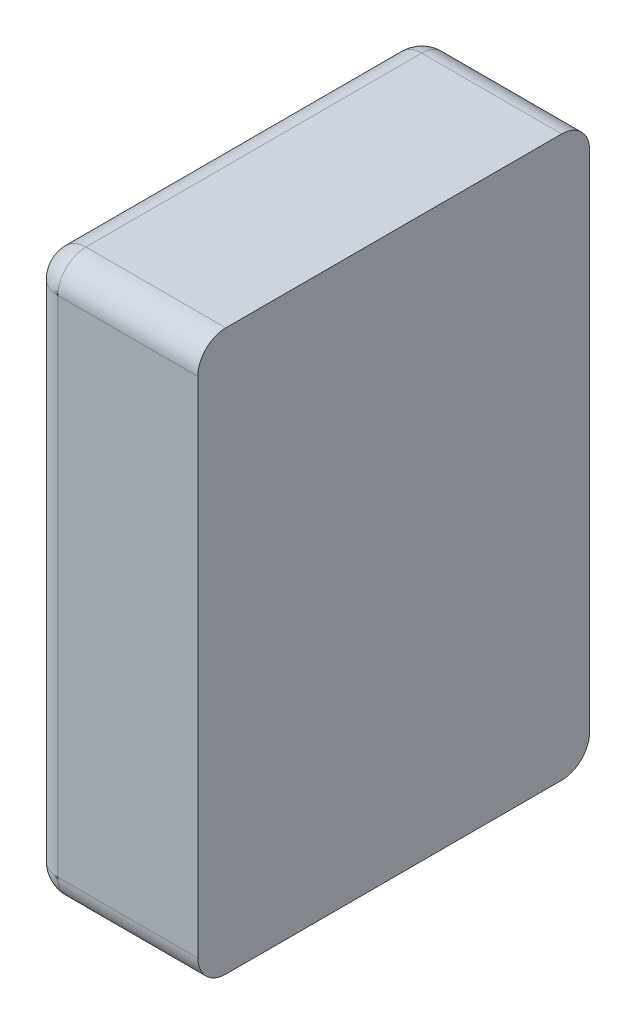
ISO-10303-21;
HEADER;
FILE_DESCRIPTION(('STEP AP214'),'2;1');
FILE_NAME('part.step','',(''),(''),'','','');
FILE_SCHEMA(('AUTOMOTIVE_DESIGN { 1 0 10303 214 1 1 1 1 }'));
ENDSEC;
DATA;
#1=APPLICATION_CONTEXT('core data for automotive mechanical design processes');
#2=APPLICATION_PROTOCOL_DEFINITION('international standard','automotive_design',2000,#1);
#3=PRODUCT_CONTEXT('',#1,'mechanical');
#4=PRODUCT('Part','Part','',(#3));
#5=PRODUCT_RELATED_PRODUCT_CATEGORY('part','',(#4));
#6=PRODUCT_DEFINITION_FORMATION('','',#4);
#7=PRODUCT_DEFINITION_CONTEXT('part definition',#1,'design');
#8=PRODUCT_DEFINITION('design','',#6,#7);
#9=PRODUCT_DEFINITION_SHAPE('','',#8);
#10=(LENGTH_UNIT() NAMED_UNIT(*) SI_UNIT(.MILLI.,.METRE.));
#11=(NAMED_UNIT(*) PLANE_ANGLE_UNIT() SI_UNIT($,.RADIAN.));
#12=(NAMED_UNIT(*) SI_UNIT($,.STERADIAN.) SOLID_ANGLE_UNIT());
#13=UNCERTAINTY_MEASURE_WITH_UNIT(LENGTH_MEASURE(1.E-05),#10,'distance_accuracy_value','');
#14=(GEOMETRIC_REPRESENTATION_CONTEXT(3) GLOBAL_UNCERTAINTY_ASSIGNED_CONTEXT((#13)) GLOBAL_UNIT_ASSIGNED_CONTEXT((#10,
#11,#12)) REPRESENTATION_CONTEXT('',''));
#15=CARTESIAN_POINT('',(0.,0.,0.));
#16=DIRECTION('',(0.,0.,1.));
#17=DIRECTION('',(1.,0.,0.));
#18=AXIS2_PLACEMENT_3D('',#15,#16,#17);
#19=CARTESIAN_POINT('',(-0.425,-0.25,0.35));
#20=DIRECTION('',(0.,0.,-1.));
#21=DIRECTION('',(0.,-1.,0.));
#22=AXIS2_PLACEMENT_3D('',#19,#20,#21);
#23=PLANE('',#22);
#24=DIRECTION('',(0.,1.,0.));
#25=VECTOR('',#24,1.);
#26=CARTESIAN_POINT('',(-0.35,-0.25,0.35));
#27=LINE('',#26,#25);
#28=CARTESIAN_POINT('',(-0.35,-0.225,0.35));
#29=VERTEX_POINT('',#28);
#30=CARTESIAN_POINT('',(-0.35,0.225,0.35));
#31=VERTEX_POINT('',#30);
#32=EDGE_CURVE('E11',#29,#31,#27,.T.);
#33=ORIENTED_EDGE('',*,*,#32,.T.);
#34=DIRECTION('',(-1.,0.,0.));
#35=VECTOR('',#34,1.);
#36=CARTESIAN_POINT('',(-0.425,0.225,0.35));
#37=LINE('',#36,#35);
#38=CARTESIAN_POINT('',(-0.475,0.225,0.35));
#39=VERTEX_POINT('',#38);
#40=EDGE_CURVE('E28',#31,#39,#37,.T.);
#41=ORIENTED_EDGE('',*,*,#40,.T.);
#42=DIRECTION('',(0.,-1.,0.));
#43=VECTOR('',#42,1.);
#44=CARTESIAN_POINT('',(-0.475,-0.25,0.35));
#45=LINE('',#44,#43);
#46=CARTESIAN_POINT('',(-0.475,-0.225,0.35));
#47=VERTEX_POINT('',#46);
#48=EDGE_CURVE('E177',#39,#47,#45,.T.);
#49=ORIENTED_EDGE('',*,*,#48,.T.);
#50=DIRECTION('',(1.,0.,0.));
#51=VECTOR('',#50,1.);
#52=CARTESIAN_POINT('',(-0.35,-0.225,0.35));
#53=LINE('',#52,#51);
#54=EDGE_CURVE('E205',#47,#29,#53,.T.);
#55=ORIENTED_EDGE('',*,*,#54,.T.);
#56=EDGE_LOOP('',(#33,#41,#49,#55));
#57=FACE_BOUND('',#56,.T.);
#58=ADVANCED_FACE('F17',(#57),#23,.F.);
#59=CARTESIAN_POINT('',(-0.5,-0.25,0.175));
#60=DIRECTION('',(1.,0.,0.));
#61=DIRECTION('',(0.,1.,0.));
#62=AXIS2_PLACEMENT_3D('',#59,#60,#61);
#63=PLANE('',#62);
#64=DIRECTION('',(0.,1.,0.));
#65=VECTOR('',#64,1.);
#66=CARTESIAN_POINT('',(-0.5,-0.25,0.325));
#67=LINE('',#66,#65);
#68=CARTESIAN_POINT('',(-0.5,-0.225,0.325));
#69=VERTEX_POINT('',#68);
#70=CARTESIAN_POINT('',(-0.5,0.225,0.325));
#71=VERTEX_POINT('',#70);
#72=EDGE_CURVE('E148',#69,#71,#67,.T.);
#73=ORIENTED_EDGE('',*,*,#72,.T.);
#74=DIRECTION('',(0.,0.,-1.));
#75=VECTOR('',#74,1.);
#76=CARTESIAN_POINT('',(-0.5,0.225,0.175));
#77=LINE('',#76,#75);
#78=CARTESIAN_POINT('',(-0.5,0.225,0.025));
#79=VERTEX_POINT('',#78);
#80=EDGE_CURVE('E116',#71,#79,#77,.T.);
#81=ORIENTED_EDGE('',*,*,#80,.T.);
#82=DIRECTION('',(0.,-1.,0.));
#83=VECTOR('',#82,1.);
#84=CARTESIAN_POINT('',(-0.5,-0.25,0.025));
#85=LINE('',#84,#83);
#86=CARTESIAN_POINT('',(-0.5,-0.225,0.025));
#87=VERTEX_POINT('',#86);
#88=EDGE_CURVE('E133',#79,#87,#85,.T.);
#89=ORIENTED_EDGE('',*,*,#88,.T.);
#90=DIRECTION('',(0.,0.,1.));
#91=VECTOR('',#90,1.);
#92=CARTESIAN_POINT('',(-0.5,-0.225,0.35));
#93=LINE('',#92,#91);
#94=EDGE_CURVE('E144',#87,#69,#93,.T.);
#95=ORIENTED_EDGE('',*,*,#94,.T.);
#96=EDGE_LOOP('',(#73,#81,#89,#95));
#97=FACE_BOUND('',#96,.T.);
#98=ADVANCED_FACE('F146',(#97),#63,.F.);
#99=CARTESIAN_POINT('',(-0.35,-0.25,0.2));
#100=DIRECTION('',(-1.,0.,0.));
#101=DIRECTION('',(0.,0.,1.));
#102=AXIS2_PLACEMENT_3D('',#99,#100,#101);
#103=PLANE('',#102);
#104=DIRECTION('',(0.,0.,1.));
#105=VECTOR('',#104,1.);
#106=CARTESIAN_POINT('',(-0.35,0.25,0.2));
#107=LINE('',#106,#105);
#108=CARTESIAN_POINT('',(-0.35,0.25,0.025));
#109=VERTEX_POINT('',#108);
#110=CARTESIAN_POINT('',(-0.35,0.25,0.325));
#111=VERTEX_POINT('',#110);
#112=EDGE_CURVE('E180',#109,#111,#107,.T.);
#113=ORIENTED_EDGE('',*,*,#112,.T.);
#114=CARTESIAN_POINT('',(-0.35,0.225,0.325));
#115=DIRECTION('',(1.,0.,0.));
#116=DIRECTION('',(0.,0.,1.));
#117=AXIS2_PLACEMENT_3D('',#114,#115,#116);
#118=CIRCLE('',#117,0.025);
#119=EDGE_CURVE('E183',#111,#31,#118,.T.);
#120=ORIENTED_EDGE('',*,*,#119,.T.);
#121=ORIENTED_EDGE('',*,*,#32,.F.);
#122=CARTESIAN_POINT('',(-0.35,-0.225,0.325));
#123=DIRECTION('',(1.,0.,0.));
#124=DIRECTION('',(0.,0.,1.));
#125=AXIS2_PLACEMENT_3D('',#122,#123,#124);
#126=CIRCLE('',#125,0.025);
#127=CARTESIAN_POINT('',(-0.35,-0.25,0.325));
#128=VERTEX_POINT('',#127);
#129=EDGE_CURVE('E196',#29,#128,#126,.T.);
#130=ORIENTED_EDGE('',*,*,#129,.T.);
#131=DIRECTION('',(0.,0.,1.));
#132=VECTOR('',#131,1.);
#133=CARTESIAN_POINT('',(-0.35,-0.25,0.2));
#134=LINE('',#133,#132);
#135=CARTESIAN_POINT('',(-0.35,-0.25,0.025));
#136=VERTEX_POINT('',#135);
#137=EDGE_CURVE('E173',#136,#128,#134,.T.);
#138=ORIENTED_EDGE('',*,*,#137,.F.);
#139=CARTESIAN_POINT('',(-0.35,-0.225,0.025));
#140=DIRECTION('',(1.,0.,0.));
#141=DIRECTION('',(0.,0.,1.));
#142=AXIS2_PLACEMENT_3D('',#139,#140,#141);
#143=CIRCLE('',#142,0.025);
#144=CARTESIAN_POINT('',(-0.35,-0.225,0.));
#145=VERTEX_POINT('',#144);
#146=EDGE_CURVE('E193',#136,#145,#143,.T.);
#147=ORIENTED_EDGE('',*,*,#146,.T.);
#148=DIRECTION('',(0.,1.,0.));
#149=VECTOR('',#148,1.);
#150=CARTESIAN_POINT('',(-0.35,-0.25,0.));
#151=LINE('',#150,#149);
#152=CARTESIAN_POINT('',(-0.35,0.225,0.));
#153=VERTEX_POINT('',#152);
#154=EDGE_CURVE('E72',#145,#153,#151,.T.);
#155=ORIENTED_EDGE('',*,*,#154,.T.);
#156=CARTESIAN_POINT('',(-0.35,0.225,0.025));
#157=DIRECTION('',(1.,0.,0.));
#158=DIRECTION('',(0.,0.,1.));
#159=AXIS2_PLACEMENT_3D('',#156,#157,#158);
#160=CIRCLE('',#159,0.025);
#161=EDGE_CURVE('E87',#153,#109,#160,.T.);
#162=ORIENTED_EDGE('',*,*,#161,.T.);
#163=EDGE_LOOP('',(#113,#120,#121,#130,#138,#147,#155,#162));
#164=FACE_BOUND('',#163,.T.);
#165=ADVANCED_FACE('F303',(#164),#103,.F.);
#166=CARTESIAN_POINT('',(-0.475,0.225,0.175));
#167=DIRECTION('',(0.,0.,1.));
#168=DIRECTION('',(-1.,0.,0.));
#169=AXIS2_PLACEMENT_3D('',#166,#167,#168);
#170=CYLINDRICAL_SURFACE('',#169,0.025);
#171=CARTESIAN_POINT('',(-0.475,0.225,0.325));
#172=DIRECTION('',(0.,0.,-1.));
#173=DIRECTION('',(1.,0.,0.));
#174=AXIS2_PLACEMENT_3D('',#171,#172,#173);
#175=CIRCLE('',#174,0.025);
#176=CARTESIAN_POINT('',(-0.475,0.25,0.325));
#177=VERTEX_POINT('',#176);
#178=EDGE_CURVE('E127',#71,#177,#175,.T.);
#179=ORIENTED_EDGE('',*,*,#178,.T.);
#180=DIRECTION('',(0.,0.,1.));
#181=VECTOR('',#180,1.);
#182=CARTESIAN_POINT('',(-0.475,0.25,0.175));
#183=LINE('',#182,#181);
#184=CARTESIAN_POINT('',(-0.475,0.25,0.025));
#185=VERTEX_POINT('',#184);
#186=EDGE_CURVE('E120',#185,#177,#183,.T.);
#187=ORIENTED_EDGE('',*,*,#186,.F.);
#188=CARTESIAN_POINT('',(-0.475,0.225,0.025));
#189=DIRECTION('',(0.,0.,1.));
#190=DIRECTION('',(-1.,0.,0.));
#191=AXIS2_PLACEMENT_3D('',#188,#189,#190);
#192=CIRCLE('',#191,0.025);
#193=EDGE_CURVE('E111',#185,#79,#192,.T.);
#194=ORIENTED_EDGE('',*,*,#193,.T.);
#195=ORIENTED_EDGE('',*,*,#80,.F.);
#196=EDGE_LOOP('',(#179,#187,#194,#195));
#197=FACE_BOUND('',#196,.T.);
#198=ADVANCED_FACE('F114',(#197),#170,.T.);
#199=CARTESIAN_POINT('',(-0.475,0.225,0.025));
#200=DIRECTION('',(0.,0.,1.));
#201=DIRECTION('',(1.,0.,0.));
#202=AXIS2_PLACEMENT_3D('',#199,#200,#201);
#203=SPHERICAL_SURFACE('',#202,0.025);
#204=CARTESIAN_POINT('',(-0.475,0.225,0.025));
#205=DIRECTION('',(-1.,0.,0.));
#206=DIRECTION('',(0.,0.,1.));
#207=AXIS2_PLACEMENT_3D('',#204,#205,#206);
#208=CIRCLE('',#207,0.025);
#209=CARTESIAN_POINT('',(-0.475,0.225,0.));
#210=VERTEX_POINT('',#209);
#211=EDGE_CURVE('E128',#185,#210,#208,.T.);
#212=ORIENTED_EDGE('',*,*,#211,.T.);
#213=CARTESIAN_POINT('',(-0.475,0.225,0.025));
#214=DIRECTION('',(0.,1.,0.));
#215=DIRECTION('',(0.,0.,1.));
#216=AXIS2_PLACEMENT_3D('',#213,#214,#215);
#217=CIRCLE('',#216,0.025);
#218=EDGE_CURVE('E136',#210,#79,#217,.T.);
#219=ORIENTED_EDGE('',*,*,#218,.T.);
#220=ORIENTED_EDGE('',*,*,#193,.F.);
#221=EDGE_LOOP('',(#212,#219,#220));
#222=FACE_BOUND('',#221,.T.);
#223=ADVANCED_FACE('F152',(#222),#203,.T.);
#224=CARTESIAN_POINT('',(-0.475,0.225,0.325));
#225=DIRECTION('',(0.,0.,1.));
#226=DIRECTION('',(1.,0.,0.));
#227=AXIS2_PLACEMENT_3D('',#224,#225,#226);
#228=SPHERICAL_SURFACE('',#227,0.025);
#229=CARTESIAN_POINT('',(-0.475,0.225,0.325));
#230=DIRECTION('',(0.,1.,0.));
#231=DIRECTION('',(0.,0.,1.));
#232=AXIS2_PLACEMENT_3D('',#229,#230,#231);
#233=CIRCLE('',#232,0.025);
#234=EDGE_CURVE('E155',#71,#39,#233,.T.);
#235=ORIENTED_EDGE('',*,*,#234,.T.);
#236=CARTESIAN_POINT('',(-0.475,0.225,0.325));
#237=DIRECTION('',(-1.,0.,0.));
#238=DIRECTION('',(0.,0.,1.));
#239=AXIS2_PLACEMENT_3D('',#236,#237,#238);
#240=CIRCLE('',#239,0.025);
#241=EDGE_CURVE('E163',#39,#177,#240,.T.);
#242=ORIENTED_EDGE('',*,*,#241,.T.);
#243=ORIENTED_EDGE('',*,*,#178,.F.);
#244=EDGE_LOOP('',(#235,#242,#243));
#245=FACE_BOUND('',#244,.T.);
#246=ADVANCED_FACE('F19',(#245),#228,.T.);
#247=CARTESIAN_POINT('',(-0.425,0.225,0.025));
#248=DIRECTION('',(-1.,0.,0.));
#249=DIRECTION('',(0.,0.,-1.));
#250=AXIS2_PLACEMENT_3D('',#247,#248,#249);
#251=CYLINDRICAL_SURFACE('',#250,0.025);
#252=ORIENTED_EDGE('',*,*,#161,.F.);
#253=DIRECTION('',(1.,0.,0.));
#254=VECTOR('',#253,1.);
#255=CARTESIAN_POINT('',(-0.425,0.225,0.));
#256=LINE('',#255,#254);
#257=EDGE_CURVE('E215',#210,#153,#256,.T.);
#258=ORIENTED_EDGE('',*,*,#257,.F.);
#259=ORIENTED_EDGE('',*,*,#211,.F.);
#260=DIRECTION('',(-1.,0.,0.));
#261=VECTOR('',#260,1.);
#262=CARTESIAN_POINT('',(-0.25,0.25,0.025));
#263=LINE('',#262,#261);
#264=EDGE_CURVE('E167',#109,#185,#263,.T.);
#265=ORIENTED_EDGE('',*,*,#264,.F.);
#266=EDGE_LOOP('',(#252,#258,#259,#265));
#267=FACE_BOUND('',#266,.T.);
#268=ADVANCED_FACE('F292',(#267),#251,.T.);
#269=CARTESIAN_POINT('',(-0.475,-0.25,0.025));
#270=DIRECTION('',(0.,-1.,0.));
#271=DIRECTION('',(0.,0.,1.));
#272=AXIS2_PLACEMENT_3D('',#269,#270,#271);
#273=CYLINDRICAL_SURFACE('',#272,0.025);
#274=CARTESIAN_POINT('',(-0.475,-0.225,0.025));
#275=DIRECTION('',(0.,1.,0.));
#276=DIRECTION('',(0.,0.,-1.));
#277=AXIS2_PLACEMENT_3D('',#274,#275,#276);
#278=CIRCLE('',#277,0.025);
#279=CARTESIAN_POINT('',(-0.475,-0.225,0.));
#280=VERTEX_POINT('',#279);
#281=EDGE_CURVE('E138',#280,#87,#278,.T.);
#282=ORIENTED_EDGE('',*,*,#281,.T.);
#283=ORIENTED_EDGE('',*,*,#88,.F.);
#284=ORIENTED_EDGE('',*,*,#218,.F.);
#285=DIRECTION('',(0.,1.,0.));
#286=VECTOR('',#285,1.);
#287=CARTESIAN_POINT('',(-0.475,-0.25,0.));
#288=LINE('',#287,#286);
#289=EDGE_CURVE('E192',#280,#210,#288,.T.);
#290=ORIENTED_EDGE('',*,*,#289,.F.);
#291=EDGE_LOOP('',(#282,#283,#284,#290));
#292=FACE_BOUND('',#291,.T.);
#293=ADVANCED_FACE('F134',(#292),#273,.T.);
#294=CARTESIAN_POINT('',(-0.475,-0.25,0.325));
#295=DIRECTION('',(0.,-1.,0.));
#296=DIRECTION('',(0.,0.,1.));
#297=AXIS2_PLACEMENT_3D('',#294,#295,#296);
#298=CYLINDRICAL_SURFACE('',#297,0.025);
#299=CARTESIAN_POINT('',(-0.475,-0.225,0.325));
#300=DIRECTION('',(0.,1.,0.));
#301=DIRECTION('',(0.,0.,-1.));
#302=AXIS2_PLACEMENT_3D('',#299,#300,#301);
#303=CIRCLE('',#302,0.025);
#304=EDGE_CURVE('E186',#69,#47,#303,.T.);
#305=ORIENTED_EDGE('',*,*,#304,.T.);
#306=ORIENTED_EDGE('',*,*,#48,.F.);
#307=ORIENTED_EDGE('',*,*,#234,.F.);
#308=ORIENTED_EDGE('',*,*,#72,.F.);
#309=EDGE_LOOP('',(#305,#306,#307,#308));
#310=FACE_BOUND('',#309,.T.);
#311=ADVANCED_FACE('F274',(#310),#298,.T.);
#312=CARTESIAN_POINT('',(-0.425,0.225,0.325));
#313=DIRECTION('',(1.,0.,0.));
#314=DIRECTION('',(0.,0.,1.));
#315=AXIS2_PLACEMENT_3D('',#312,#313,#314);
#316=CYLINDRICAL_SURFACE('',#315,0.025);
#317=ORIENTED_EDGE('',*,*,#119,.F.);
#318=DIRECTION('',(1.,0.,0.));
#319=VECTOR('',#318,1.);
#320=CARTESIAN_POINT('',(-0.25,0.25,0.325));
#321=LINE('',#320,#319);
#322=EDGE_CURVE('E200',#177,#111,#321,.T.);
#323=ORIENTED_EDGE('',*,*,#322,.F.);
#324=ORIENTED_EDGE('',*,*,#241,.F.);
#325=ORIENTED_EDGE('',*,*,#40,.F.);
#326=EDGE_LOOP('',(#317,#323,#324,#325));
#327=FACE_BOUND('',#326,.T.);
#328=ADVANCED_FACE('F300',(#327),#316,.T.);
#329=CARTESIAN_POINT('',(-0.475,-0.225,0.025));
#330=DIRECTION('',(0.,0.,1.));
#331=DIRECTION('',(1.,0.,0.));
#332=AXIS2_PLACEMENT_3D('',#329,#330,#331);
#333=SPHERICAL_SURFACE('',#332,0.025);
#334=CARTESIAN_POINT('',(-0.475,-0.225,0.025));
#335=DIRECTION('',(-1.,0.,0.));
#336=DIRECTION('',(0.,0.,1.));
#337=AXIS2_PLACEMENT_3D('',#334,#335,#336);
#338=CIRCLE('',#337,0.025);
#339=CARTESIAN_POINT('',(-0.475,-0.25,0.025));
#340=VERTEX_POINT('',#339);
#341=EDGE_CURVE('E220',#280,#340,#338,.T.);
#342=ORIENTED_EDGE('',*,*,#341,.T.);
#343=CARTESIAN_POINT('',(-0.475,-0.225,0.025));
#344=DIRECTION('',(0.,0.,-1.));
#345=DIRECTION('',(-1.,0.,0.));
#346=AXIS2_PLACEMENT_3D('',#343,#344,#345);
#347=CIRCLE('',#346,0.025);
#348=EDGE_CURVE('E225',#340,#87,#347,.T.);
#349=ORIENTED_EDGE('',*,*,#348,.T.);
#350=ORIENTED_EDGE('',*,*,#281,.F.);
#351=EDGE_LOOP('',(#342,#349,#350));
#352=FACE_BOUND('',#351,.T.);
#353=ADVANCED_FACE('F250',(#352),#333,.T.);
#354=CARTESIAN_POINT('',(-0.475,-0.225,0.325));
#355=DIRECTION('',(0.,0.,1.));
#356=DIRECTION('',(1.,0.,0.));
#357=AXIS2_PLACEMENT_3D('',#354,#355,#356);
#358=SPHERICAL_SURFACE('',#357,0.025);
#359=CARTESIAN_POINT('',(-0.475,-0.225,0.325));
#360=DIRECTION('',(0.,0.,1.));
#361=DIRECTION('',(1.,0.,0.));
#362=AXIS2_PLACEMENT_3D('',#359,#360,#361);
#363=CIRCLE('',#362,0.025);
#364=CARTESIAN_POINT('',(-0.475,-0.25,0.325));
#365=VERTEX_POINT('',#364);
#366=EDGE_CURVE('E221',#69,#365,#363,.T.);
#367=ORIENTED_EDGE('',*,*,#366,.T.);
#368=CARTESIAN_POINT('',(-0.475,-0.225,0.325));
#369=DIRECTION('',(-1.,0.,0.));
#370=DIRECTION('',(0.,0.,1.));
#371=AXIS2_PLACEMENT_3D('',#368,#369,#370);
#372=CIRCLE('',#371,0.025);
#373=EDGE_CURVE('E199',#365,#47,#372,.T.);
#374=ORIENTED_EDGE('',*,*,#373,.T.);
#375=ORIENTED_EDGE('',*,*,#304,.F.);
#376=EDGE_LOOP('',(#367,#374,#375));
#377=FACE_BOUND('',#376,.T.);
#378=ADVANCED_FACE('F271',(#377),#358,.T.);
#379=CARTESIAN_POINT('',(-0.25,-0.225,0.025));
#380=DIRECTION('',(1.,0.,0.));
#381=DIRECTION('',(0.,0.,1.));
#382=AXIS2_PLACEMENT_3D('',#379,#380,#381);
#383=CYLINDRICAL_SURFACE('',#382,0.025);
#384=ORIENTED_EDGE('',*,*,#146,.F.);
#385=DIRECTION('',(1.,0.,0.));
#386=VECTOR('',#385,1.);
#387=CARTESIAN_POINT('',(-0.35,-0.25,0.025));
#388=LINE('',#387,#386);
#389=EDGE_CURVE('E188',#340,#136,#388,.T.);
#390=ORIENTED_EDGE('',*,*,#389,.F.);
#391=ORIENTED_EDGE('',*,*,#341,.F.);
#392=DIRECTION('',(-1.,0.,0.));
#393=VECTOR('',#392,1.);
#394=CARTESIAN_POINT('',(-0.5,-0.225,0.));
#395=LINE('',#394,#393);
#396=EDGE_CURVE('E21',#145,#280,#395,.T.);
#397=ORIENTED_EDGE('',*,*,#396,.F.);
#398=EDGE_LOOP('',(#384,#390,#391,#397));
#399=FACE_BOUND('',#398,.T.);
#400=ADVANCED_FACE('F305',(#399),#383,.T.);
#401=CARTESIAN_POINT('',(-0.475,-0.225,0.175));
#402=DIRECTION('',(0.,0.,-1.));
#403=DIRECTION('',(1.,0.,0.));
#404=AXIS2_PLACEMENT_3D('',#401,#402,#403);
#405=CYLINDRICAL_SURFACE('',#404,0.025);
#406=ORIENTED_EDGE('',*,*,#348,.F.);
#407=DIRECTION('',(0.,0.,-1.));
#408=VECTOR('',#407,1.);
#409=CARTESIAN_POINT('',(-0.475,-0.25,0.));
#410=LINE('',#409,#408);
#411=EDGE_CURVE('E174',#365,#340,#410,.T.);
#412=ORIENTED_EDGE('',*,*,#411,.F.);
#413=ORIENTED_EDGE('',*,*,#366,.F.);
#414=ORIENTED_EDGE('',*,*,#94,.F.);
#415=EDGE_LOOP('',(#406,#412,#413,#414));
#416=FACE_BOUND('',#415,.T.);
#417=ADVANCED_FACE('F264',(#416),#405,.T.);
#418=CARTESIAN_POINT('',(-0.25,-0.225,0.325));
#419=DIRECTION('',(-1.,0.,0.));
#420=DIRECTION('',(0.,0.,-1.));
#421=AXIS2_PLACEMENT_3D('',#418,#419,#420);
#422=CYLINDRICAL_SURFACE('',#421,0.025);
#423=ORIENTED_EDGE('',*,*,#129,.F.);
#424=ORIENTED_EDGE('',*,*,#54,.F.);
#425=ORIENTED_EDGE('',*,*,#373,.F.);
#426=DIRECTION('',(-1.,0.,0.));
#427=VECTOR('',#426,1.);
#428=CARTESIAN_POINT('',(-0.5,-0.25,0.325));
#429=LINE('',#428,#427);
#430=EDGE_CURVE('E169',#128,#365,#429,.T.);
#431=ORIENTED_EDGE('',*,*,#430,.F.);
#432=EDGE_LOOP('',(#423,#424,#425,#431));
#433=FACE_BOUND('',#432,.T.);
#434=ADVANCED_FACE('F268',(#433),#422,.T.);
#435=CARTESIAN_POINT('',(-0.25,0.25,0.175));
#436=DIRECTION('',(0.,-1.,0.));
#437=DIRECTION('',(0.,0.,-1.));
#438=AXIS2_PLACEMENT_3D('',#435,#436,#437);
#439=PLANE('',#438);
#440=ORIENTED_EDGE('',*,*,#186,.T.);
#441=ORIENTED_EDGE('',*,*,#322,.T.);
#442=ORIENTED_EDGE('',*,*,#112,.F.);
#443=ORIENTED_EDGE('',*,*,#264,.T.);
#444=EDGE_LOOP('',(#440,#441,#442,#443));
#445=FACE_BOUND('',#444,.T.);
#446=ADVANCED_FACE('F289',(#445),#439,.F.);
#447=CARTESIAN_POINT('',(-0.25,-0.25,0.175));
#448=DIRECTION('',(0.,-1.,0.));
#449=DIRECTION('',(0.,0.,-1.));
#450=AXIS2_PLACEMENT_3D('',#447,#448,#449);
#451=PLANE('',#450);
#452=ORIENTED_EDGE('',*,*,#137,.T.);
#453=ORIENTED_EDGE('',*,*,#430,.T.);
#454=ORIENTED_EDGE('',*,*,#411,.T.);
#455=ORIENTED_EDGE('',*,*,#389,.T.);
#456=EDGE_LOOP('',(#452,#453,#454,#455));
#457=FACE_BOUND('',#456,.T.);
#458=ADVANCED_FACE('F259',(#457),#451,.T.);
#459=CARTESIAN_POINT('',(-0.425,-0.25,0.));
#460=DIRECTION('',(0.,0.,1.));
#461=DIRECTION('',(1.,0.,0.));
#462=AXIS2_PLACEMENT_3D('',#459,#460,#461);
#463=PLANE('',#462);
#464=ORIENTED_EDGE('',*,*,#289,.T.);
#465=ORIENTED_EDGE('',*,*,#257,.T.);
#466=ORIENTED_EDGE('',*,*,#154,.F.);
#467=ORIENTED_EDGE('',*,*,#396,.T.);
#468=EDGE_LOOP('',(#464,#465,#466,#467));
#469=FACE_BOUND('',#468,.T.);
#470=ADVANCED_FACE('F293',(#469),#463,.F.);
#471=CLOSED_SHELL('',(#58,#98,#165,#198,#223,#246,#268,#293,#311,#328,#353,#378,#400,#417,#434,
#446,#458,#470));
#472=MANIFOLD_SOLID_BREP('B1',#471);
#473=ADVANCED_BREP_SHAPE_REPRESENTATION('',(#18,#472),#14);
#474=SHAPE_DEFINITION_REPRESENTATION(#9,#473);
ENDSEC;
END-ISO-10303-21;
